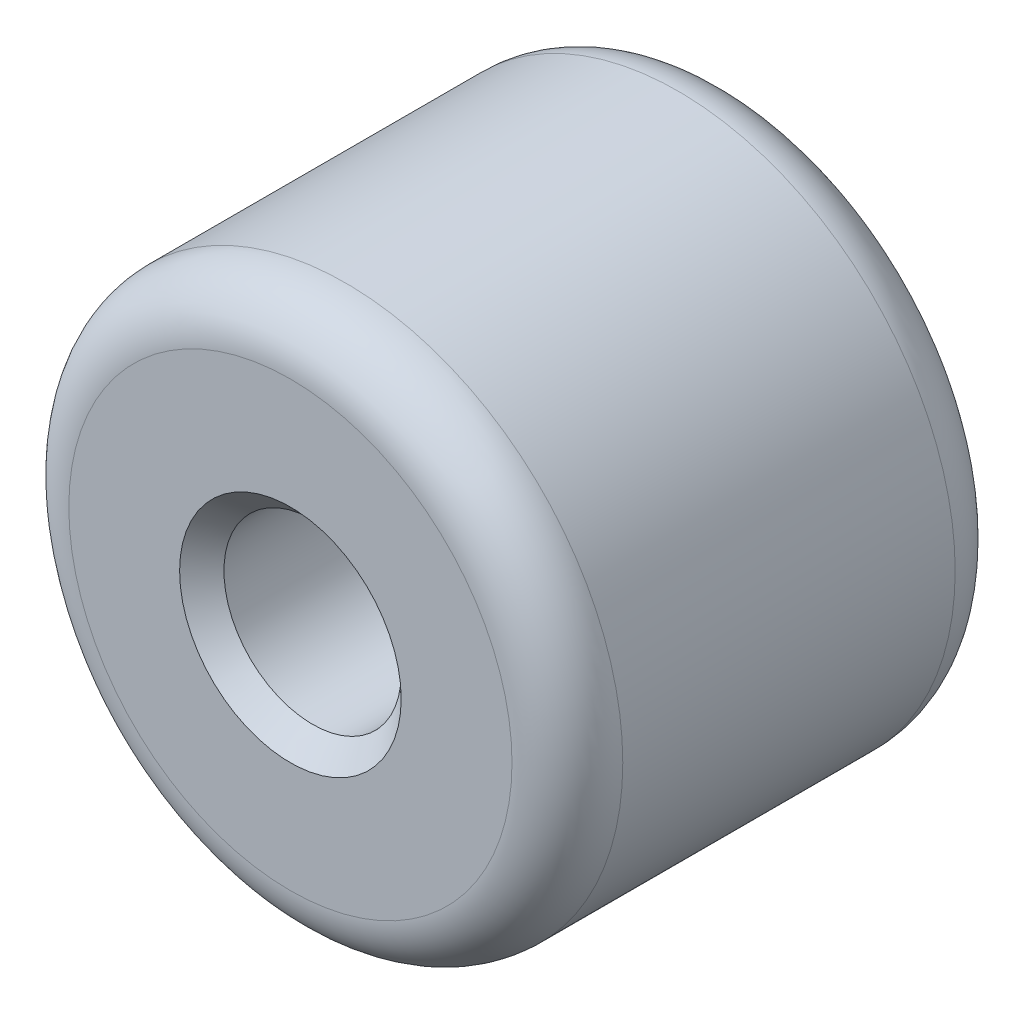
ISO-10303-21;
HEADER;
FILE_DESCRIPTION(('STEP AP214'),'2;1');
FILE_NAME('part.step','',(''),(''),'','','');
FILE_SCHEMA(('AUTOMOTIVE_DESIGN { 1 0 10303 214 1 1 1 1 }'));
ENDSEC;
DATA;
#1=APPLICATION_CONTEXT('core data for automotive mechanical design processes');
#2=APPLICATION_PROTOCOL_DEFINITION('international standard','automotive_design',2000,#1);
#3=PRODUCT_CONTEXT('',#1,'mechanical');
#4=PRODUCT('Part','Part','',(#3));
#5=PRODUCT_RELATED_PRODUCT_CATEGORY('part','',(#4));
#6=PRODUCT_DEFINITION_FORMATION('','',#4);
#7=PRODUCT_DEFINITION_CONTEXT('part definition',#1,'design');
#8=PRODUCT_DEFINITION('design','',#6,#7);
#9=PRODUCT_DEFINITION_SHAPE('','',#8);
#10=(LENGTH_UNIT() NAMED_UNIT(*) SI_UNIT(.MILLI.,.METRE.));
#11=(NAMED_UNIT(*) PLANE_ANGLE_UNIT() SI_UNIT($,.RADIAN.));
#12=(NAMED_UNIT(*) SI_UNIT($,.STERADIAN.) SOLID_ANGLE_UNIT());
#13=UNCERTAINTY_MEASURE_WITH_UNIT(LENGTH_MEASURE(1.E-05),#10,'distance_accuracy_value','');
#14=(GEOMETRIC_REPRESENTATION_CONTEXT(3) GLOBAL_UNCERTAINTY_ASSIGNED_CONTEXT((#13)) GLOBAL_UNIT_ASSIGNED_CONTEXT((#10,
#11,#12)) REPRESENTATION_CONTEXT('',''));
#15=CARTESIAN_POINT('',(0.,0.,0.));
#16=DIRECTION('',(0.,0.,1.));
#17=DIRECTION('',(1.,0.,0.));
#18=AXIS2_PLACEMENT_3D('',#15,#16,#17);
#19=CARTESIAN_POINT('',(0.,0.,-2.));
#20=DIRECTION('',(0.,0.,1.));
#21=DIRECTION('',(1.,0.,0.));
#22=AXIS2_PLACEMENT_3D('',#19,#20,#21);
#23=CYLINDRICAL_SURFACE('',#22,0.8);
#24=CARTESIAN_POINT('',(0.,0.,-1.5));
#25=DIRECTION('',(0.,0.,1.));
#26=DIRECTION('',(1.,0.,0.));
#27=AXIS2_PLACEMENT_3D('',#24,#25,#26);
#28=CIRCLE('',#27,0.8);
#29=CARTESIAN_POINT('',(0.8,0.,-1.5));
#30=VERTEX_POINT('',#29);
#31=EDGE_CURVE('E92',#30,#30,#28,.T.);
#32=ORIENTED_EDGE('',*,*,#31,.F.);
#33=EDGE_LOOP('',(#32));
#34=FACE_BOUND('',#33,.T.);
#35=CARTESIAN_POINT('',(0.,0.,1.79999999994607));
#36=DIRECTION('',(0.,0.,1.));
#37=DIRECTION('',(1.,0.,0.));
#38=AXIS2_PLACEMENT_3D('',#35,#36,#37);
#39=CIRCLE('',#38,0.799999999969714);
#40=CARTESIAN_POINT('',(0.799999999969714,0.,1.79999999994607));
#41=VERTEX_POINT('',#40);
#42=EDGE_CURVE('E95',#41,#41,#39,.T.);
#43=ORIENTED_EDGE('',*,*,#42,.T.);
#44=EDGE_LOOP('',(#43));
#45=FACE_BOUND('',#44,.T.);
#46=ADVANCED_FACE('F13',(#34,#45),#23,.F.);
#47=CARTESIAN_POINT('',(0.,0.,2.00000000000955));
#48=DIRECTION('',(0.,0.,1.));
#49=DIRECTION('',(1.,0.,0.));
#50=AXIS2_PLACEMENT_3D('',#47,#48,#49);
#51=CONICAL_SURFACE('',#50,1.0000000000332,0.785398163397448);
#52=ORIENTED_EDGE('',*,*,#42,.F.);
#53=EDGE_LOOP('',(#52));
#54=FACE_BOUND('',#53,.T.);
#55=CARTESIAN_POINT('',(0.,0.,2.00000000000955));
#56=DIRECTION('',(0.,0.,1.));
#57=DIRECTION('',(1.,0.,0.));
#58=AXIS2_PLACEMENT_3D('',#55,#56,#57);
#59=CIRCLE('',#58,1.0000000000332);
#60=CARTESIAN_POINT('',(1.0000000000332,0.,2.00000000000955));
#61=VERTEX_POINT('',#60);
#62=EDGE_CURVE('E16',#61,#61,#59,.F.);
#63=ORIENTED_EDGE('',*,*,#62,.F.);
#64=EDGE_LOOP('',(#63));
#65=FACE_BOUND('',#64,.T.);
#66=ADVANCED_FACE('F85',(#54,#65),#51,.F.);
#67=CARTESIAN_POINT('',(0.,0.,-1.5));
#68=DIRECTION('',(0.,0.,1.));
#69=DIRECTION('',(1.,0.,0.));
#70=AXIS2_PLACEMENT_3D('',#67,#68,#69);
#71=TOROIDAL_SURFACE('',#70,1.3,0.5);
#72=ORIENTED_EDGE('',*,*,#31,.T.);
#73=EDGE_LOOP('',(#72));
#74=FACE_BOUND('',#73,.T.);
#75=CARTESIAN_POINT('',(0.,0.,-2.));
#76=DIRECTION('',(0.,0.,-1.));
#77=DIRECTION('',(1.,0.,0.));
#78=AXIS2_PLACEMENT_3D('',#75,#76,#77);
#79=CIRCLE('',#78,1.3);
#80=CARTESIAN_POINT('',(1.3,0.,-2.));
#81=VERTEX_POINT('',#80);
#82=EDGE_CURVE('E101',#81,#81,#79,.T.);
#83=ORIENTED_EDGE('',*,*,#82,.T.);
#84=EDGE_LOOP('',(#83));
#85=FACE_BOUND('',#84,.T.);
#86=ADVANCED_FACE('F79',(#74,#85),#71,.T.);
#87=CARTESIAN_POINT('',(0.,0.,2.));
#88=DIRECTION('',(0.,0.,1.));
#89=DIRECTION('',(1.,0.,0.));
#90=AXIS2_PLACEMENT_3D('',#87,#88,#89);
#91=PLANE('',#90);
#92=ORIENTED_EDGE('',*,*,#62,.T.);
#93=EDGE_LOOP('',(#92));
#94=FACE_BOUND('',#93,.T.);
#95=CARTESIAN_POINT('',(0.,0.,2.));
#96=DIRECTION('',(0.,0.,-1.));
#97=DIRECTION('',(1.,0.,0.));
#98=AXIS2_PLACEMENT_3D('',#95,#96,#97);
#99=CIRCLE('',#98,2.);
#100=CARTESIAN_POINT('',(2.,0.,2.));
#101=VERTEX_POINT('',#100);
#102=EDGE_CURVE('E63',#101,#101,#99,.T.);
#103=ORIENTED_EDGE('',*,*,#102,.F.);
#104=EDGE_LOOP('',(#103));
#105=FACE_BOUND('',#104,.T.);
#106=ADVANCED_FACE('F69',(#94,#105),#91,.T.);
#107=CARTESIAN_POINT('',(0.,0.,-2.));
#108=DIRECTION('',(0.,0.,1.));
#109=DIRECTION('',(1.,0.,0.));
#110=AXIS2_PLACEMENT_3D('',#107,#108,#109);
#111=PLANE('',#110);
#112=ORIENTED_EDGE('',*,*,#82,.F.);
#113=EDGE_LOOP('',(#112));
#114=FACE_BOUND('',#113,.T.);
#115=CARTESIAN_POINT('',(0.,0.,-2.));
#116=DIRECTION('',(0.,0.,1.));
#117=DIRECTION('',(1.,0.,0.));
#118=AXIS2_PLACEMENT_3D('',#115,#116,#117);
#119=CIRCLE('',#118,2.);
#120=CARTESIAN_POINT('',(2.,0.,-2.));
#121=VERTEX_POINT('',#120);
#122=EDGE_CURVE('E25',#121,#121,#119,.T.);
#123=ORIENTED_EDGE('',*,*,#122,.F.);
#124=EDGE_LOOP('',(#123));
#125=FACE_BOUND('',#124,.T.);
#126=ADVANCED_FACE('F78',(#114,#125),#111,.F.);
#127=CARTESIAN_POINT('',(0.,0.,1.5));
#128=DIRECTION('',(0.,0.,1.));
#129=DIRECTION('',(1.,0.,0.));
#130=AXIS2_PLACEMENT_3D('',#127,#128,#129);
#131=TOROIDAL_SURFACE('',#130,2.,0.5);
#132=ORIENTED_EDGE('',*,*,#102,.T.);
#133=EDGE_LOOP('',(#132));
#134=FACE_BOUND('',#133,.T.);
#135=CARTESIAN_POINT('',(0.,0.,1.5));
#136=DIRECTION('',(0.,0.,1.));
#137=DIRECTION('',(1.,0.,0.));
#138=AXIS2_PLACEMENT_3D('',#135,#136,#137);
#139=CIRCLE('',#138,2.5);
#140=CARTESIAN_POINT('',(2.5,0.,1.5));
#141=VERTEX_POINT('',#140);
#142=EDGE_CURVE('E20',#141,#141,#139,.F.);
#143=ORIENTED_EDGE('',*,*,#142,.F.);
#144=EDGE_LOOP('',(#143));
#145=FACE_BOUND('',#144,.T.);
#146=ADVANCED_FACE('F43',(#134,#145),#131,.T.);
#147=CARTESIAN_POINT('',(0.,0.,-1.5));
#148=DIRECTION('',(0.,0.,1.));
#149=DIRECTION('',(1.,0.,0.));
#150=AXIS2_PLACEMENT_3D('',#147,#148,#149);
#151=TOROIDAL_SURFACE('',#150,2.,0.5);
#152=ORIENTED_EDGE('',*,*,#122,.T.);
#153=EDGE_LOOP('',(#152));
#154=FACE_BOUND('',#153,.T.);
#155=CARTESIAN_POINT('',(0.,0.,-1.5));
#156=DIRECTION('',(0.,0.,1.));
#157=DIRECTION('',(1.,0.,0.));
#158=AXIS2_PLACEMENT_3D('',#155,#156,#157);
#159=CIRCLE('',#158,2.5);
#160=CARTESIAN_POINT('',(2.5,0.,-1.5));
#161=VERTEX_POINT('',#160);
#162=EDGE_CURVE('E9',#161,#161,#159,.T.);
#163=ORIENTED_EDGE('',*,*,#162,.F.);
#164=EDGE_LOOP('',(#163));
#165=FACE_BOUND('',#164,.T.);
#166=ADVANCED_FACE('F37',(#154,#165),#151,.T.);
#167=CARTESIAN_POINT('',(0.,0.,-2.));
#168=DIRECTION('',(0.,0.,1.));
#169=DIRECTION('',(1.,0.,0.));
#170=AXIS2_PLACEMENT_3D('',#167,#168,#169);
#171=CYLINDRICAL_SURFACE('',#170,2.5);
#172=ORIENTED_EDGE('',*,*,#162,.T.);
#173=EDGE_LOOP('',(#172));
#174=FACE_BOUND('',#173,.T.);
#175=ORIENTED_EDGE('',*,*,#142,.T.);
#176=EDGE_LOOP('',(#175));
#177=FACE_BOUND('',#176,.T.);
#178=ADVANCED_FACE('F42',(#174,#177),#171,.T.);
#179=CLOSED_SHELL('',(#46,#66,#86,#106,#126,#146,#166,#178));
#180=MANIFOLD_SOLID_BREP('B1',#179);
#181=ADVANCED_BREP_SHAPE_REPRESENTATION('',(#18,#180),#14);
#182=SHAPE_DEFINITION_REPRESENTATION(#9,#181);
ENDSEC;
END-ISO-10303-21;
